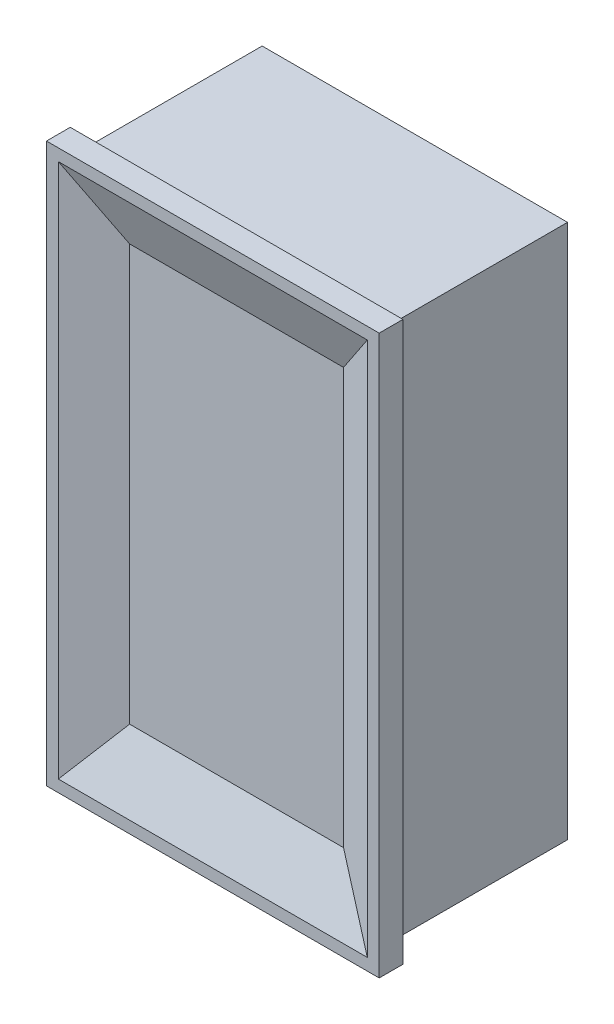
ISO-10303-21;
HEADER;
FILE_DESCRIPTION(('STEP AP214'),'2;1');
FILE_NAME('part.step','',(''),(''),'','','');
FILE_SCHEMA(('AUTOMOTIVE_DESIGN { 1 0 10303 214 1 1 1 1 }'));
ENDSEC;
DATA;
#1=APPLICATION_CONTEXT('core data for automotive mechanical design processes');
#2=APPLICATION_PROTOCOL_DEFINITION('international standard','automotive_design',2000,#1);
#3=PRODUCT_CONTEXT('',#1,'mechanical');
#4=PRODUCT('Part','Part','',(#3));
#5=PRODUCT_RELATED_PRODUCT_CATEGORY('part','',(#4));
#6=PRODUCT_DEFINITION_FORMATION('','',#4);
#7=PRODUCT_DEFINITION_CONTEXT('part definition',#1,'design');
#8=PRODUCT_DEFINITION('design','',#6,#7);
#9=PRODUCT_DEFINITION_SHAPE('','',#8);
#10=(LENGTH_UNIT() NAMED_UNIT(*) SI_UNIT(.MILLI.,.METRE.));
#11=(NAMED_UNIT(*) PLANE_ANGLE_UNIT() SI_UNIT($,.RADIAN.));
#12=(NAMED_UNIT(*) SI_UNIT($,.STERADIAN.) SOLID_ANGLE_UNIT());
#13=UNCERTAINTY_MEASURE_WITH_UNIT(LENGTH_MEASURE(1.E-05),#10,'distance_accuracy_value','');
#14=(GEOMETRIC_REPRESENTATION_CONTEXT(3) GLOBAL_UNCERTAINTY_ASSIGNED_CONTEXT((#13)) GLOBAL_UNIT_ASSIGNED_CONTEXT((#10,
#11,#12)) REPRESENTATION_CONTEXT('',''));
#15=CARTESIAN_POINT('',(0.,0.,0.));
#16=DIRECTION('',(0.,0.,1.));
#17=DIRECTION('',(1.,0.,0.));
#18=AXIS2_PLACEMENT_3D('',#15,#16,#17);
#19=CARTESIAN_POINT('',(0.,0.,15.));
#20=DIRECTION('',(0.,0.,1.));
#21=DIRECTION('',(1.,0.,0.));
#22=AXIS2_PLACEMENT_3D('',#19,#20,#21);
#23=PLANE('',#22);
#24=DIRECTION('',(-1.,0.,0.));
#25=VECTOR('',#24,1.);
#26=CARTESIAN_POINT('',(-14.,23.5,15.));
#27=LINE('',#26,#25);
#28=CARTESIAN_POINT('',(14.,23.5,15.));
#29=VERTEX_POINT('',#28);
#30=CARTESIAN_POINT('',(-14.,23.5,15.));
#31=VERTEX_POINT('',#30);
#32=EDGE_CURVE('E181',#29,#31,#27,.T.);
#33=ORIENTED_EDGE('',*,*,#32,.F.);
#34=DIRECTION('',(0.,1.,0.));
#35=VECTOR('',#34,1.);
#36=CARTESIAN_POINT('',(14.,23.5,15.));
#37=LINE('',#36,#35);
#38=CARTESIAN_POINT('',(14.,-23.5,15.));
#39=VERTEX_POINT('',#38);
#40=EDGE_CURVE('E175',#39,#29,#37,.T.);
#41=ORIENTED_EDGE('',*,*,#40,.F.);
#42=DIRECTION('',(1.,0.,0.));
#43=VECTOR('',#42,1.);
#44=CARTESIAN_POINT('',(13.,-23.5,15.));
#45=LINE('',#44,#43);
#46=CARTESIAN_POINT('',(-14.,-23.5,15.));
#47=VERTEX_POINT('',#46);
#48=EDGE_CURVE('E195',#47,#39,#45,.T.);
#49=ORIENTED_EDGE('',*,*,#48,.F.);
#50=DIRECTION('',(0.,-1.,0.));
#51=VECTOR('',#50,1.);
#52=CARTESIAN_POINT('',(-14.,-22.5,15.));
#53=LINE('',#52,#51);
#54=EDGE_CURVE('E199',#31,#47,#53,.T.);
#55=ORIENTED_EDGE('',*,*,#54,.F.);
#56=EDGE_LOOP('',(#33,#41,#49,#55));
#57=FACE_BOUND('',#56,.T.);
#58=DIRECTION('',(1.,0.,0.));
#59=VECTOR('',#58,1.);
#60=CARTESIAN_POINT('',(12.85,22.5,15.));
#61=LINE('',#60,#59);
#62=CARTESIAN_POINT('',(-12.85,22.5,15.));
#63=VERTEX_POINT('',#62);
#64=CARTESIAN_POINT('',(12.85,22.5,15.));
#65=VERTEX_POINT('',#64);
#66=EDGE_CURVE('E70',#63,#65,#61,.T.);
#67=ORIENTED_EDGE('',*,*,#66,.F.);
#68=DIRECTION('',(0.,1.,0.));
#69=VECTOR('',#68,1.);
#70=CARTESIAN_POINT('',(-12.85,22.5,15.));
#71=LINE('',#70,#69);
#72=CARTESIAN_POINT('',(-12.85,-22.5,15.));
#73=VERTEX_POINT('',#72);
#74=EDGE_CURVE('E74',#73,#63,#71,.T.);
#75=ORIENTED_EDGE('',*,*,#74,.F.);
#76=DIRECTION('',(-1.,0.,0.));
#77=VECTOR('',#76,1.);
#78=CARTESIAN_POINT('',(-12.85,-22.5,15.));
#79=LINE('',#78,#77);
#80=CARTESIAN_POINT('',(12.85,-22.5,15.));
#81=VERTEX_POINT('',#80);
#82=EDGE_CURVE('E675',#81,#73,#79,.T.);
#83=ORIENTED_EDGE('',*,*,#82,.F.);
#84=DIRECTION('',(0.,-1.,0.));
#85=VECTOR('',#84,1.);
#86=CARTESIAN_POINT('',(12.85,-22.5,15.));
#87=LINE('',#86,#85);
#88=EDGE_CURVE('E681',#65,#81,#87,.T.);
#89=ORIENTED_EDGE('',*,*,#88,.F.);
#90=EDGE_LOOP('',(#67,#75,#83,#89));
#91=FACE_BOUND('',#90,.T.);
#92=ADVANCED_FACE('F53',(#57,#91),#23,.F.);
#93=CARTESIAN_POINT('',(0.,-20.,16.));
#94=DIRECTION('',(0.,-0.371390676354086,-0.928476690885266));
#95=DIRECTION('',(0.,-0.928476690885266,0.371390676354086));
#96=AXIS2_PLACEMENT_3D('',#93,#94,#95);
#97=PLANE('',#96);
#98=DIRECTION('',(0.596284793999924,-0.74535599249993,0.298142397000012));
#99=VECTOR('',#98,1.);
#100=CARTESIAN_POINT('',(9.,-17.5,15.));
#101=LINE('',#100,#99);
#102=CARTESIAN_POINT('',(9.,-17.5,15.));
#103=VERTEX_POINT('',#102);
#104=CARTESIAN_POINT('',(13.,-22.5,17.));
#105=VERTEX_POINT('',#104);
#106=EDGE_CURVE('E273',#103,#105,#101,.T.);
#107=ORIENTED_EDGE('',*,*,#106,.F.);
#108=DIRECTION('',(-1.,0.,0.));
#109=VECTOR('',#108,1.);
#110=CARTESIAN_POINT('',(9.,-17.5,15.));
#111=LINE('',#110,#109);
#112=CARTESIAN_POINT('',(-9.,-17.5,15.));
#113=VERTEX_POINT('',#112);
#114=EDGE_CURVE('E338',#103,#113,#111,.T.);
#115=ORIENTED_EDGE('',*,*,#114,.T.);
#116=DIRECTION('',(-0.596284793999924,-0.74535599249993,0.298142397000012));
#117=VECTOR('',#116,1.);
#118=CARTESIAN_POINT('',(-9.,-17.5,15.));
#119=LINE('',#118,#117);
#120=CARTESIAN_POINT('',(-12.9999999999998,-22.5,17.));
#121=VERTEX_POINT('',#120);
#122=EDGE_CURVE('E333',#113,#121,#119,.T.);
#123=ORIENTED_EDGE('',*,*,#122,.T.);
#124=DIRECTION('',(1.,0.,0.));
#125=VECTOR('',#124,1.);
#126=CARTESIAN_POINT('',(-13.,-22.5,17.));
#127=LINE('',#126,#125);
#128=EDGE_CURVE('E12',#121,#105,#127,.T.);
#129=ORIENTED_EDGE('',*,*,#128,.T.);
#130=EDGE_LOOP('',(#107,#115,#123,#129));
#131=FACE_BOUND('',#130,.T.);
#132=ADVANCED_FACE('F418',(#131),#97,.F.);
#133=CARTESIAN_POINT('',(-11.,0.,16.));
#134=DIRECTION('',(-0.447213595499998,0.,-0.894427190999896));
#135=DIRECTION('',(-0.894427190999896,0.,0.447213595499998));
#136=AXIS2_PLACEMENT_3D('',#133,#134,#135);
#137=PLANE('',#136);
#138=ORIENTED_EDGE('',*,*,#122,.F.);
#139=DIRECTION('',(0.,1.,0.));
#140=VECTOR('',#139,1.);
#141=CARTESIAN_POINT('',(-9.,-17.5,15.));
#142=LINE('',#141,#140);
#143=CARTESIAN_POINT('',(-9.,17.5,15.));
#144=VERTEX_POINT('',#143);
#145=EDGE_CURVE('E342',#113,#144,#142,.T.);
#146=ORIENTED_EDGE('',*,*,#145,.T.);
#147=DIRECTION('',(-0.596284793999924,0.74535599249993,0.298142397000012));
#148=VECTOR('',#147,1.);
#149=CARTESIAN_POINT('',(-9.,17.5,15.));
#150=LINE('',#149,#148);
#151=CARTESIAN_POINT('',(-12.9999999999998,22.5,17.));
#152=VERTEX_POINT('',#151);
#153=EDGE_CURVE('E296',#144,#152,#150,.T.);
#154=ORIENTED_EDGE('',*,*,#153,.T.);
#155=DIRECTION('',(0.,-1.,0.));
#156=VECTOR('',#155,1.);
#157=CARTESIAN_POINT('',(-13.,22.5,17.));
#158=LINE('',#157,#156);
#159=EDGE_CURVE('E62',#152,#121,#158,.T.);
#160=ORIENTED_EDGE('',*,*,#159,.T.);
#161=EDGE_LOOP('',(#138,#146,#154,#160));
#162=FACE_BOUND('',#161,.T.);
#163=ADVANCED_FACE('F414',(#162),#137,.F.);
#164=CARTESIAN_POINT('',(0.,20.,16.));
#165=DIRECTION('',(0.,0.371390676354086,-0.928476690885266));
#166=DIRECTION('',(-1.,0.,0.));
#167=AXIS2_PLACEMENT_3D('',#164,#165,#166);
#168=PLANE('',#167);
#169=ORIENTED_EDGE('',*,*,#153,.F.);
#170=DIRECTION('',(1.,0.,0.));
#171=VECTOR('',#170,1.);
#172=CARTESIAN_POINT('',(-9.,17.5,15.));
#173=LINE('',#172,#171);
#174=CARTESIAN_POINT('',(9.0000000000002,17.5000000000002,15.));
#175=VERTEX_POINT('',#174);
#176=EDGE_CURVE('E207',#144,#175,#173,.T.);
#177=ORIENTED_EDGE('',*,*,#176,.T.);
#178=DIRECTION('',(0.596284793999924,0.74535599249993,0.298142397000012));
#179=VECTOR('',#178,1.);
#180=CARTESIAN_POINT('',(9.,17.5,15.));
#181=LINE('',#180,#179);
#182=CARTESIAN_POINT('',(13.,22.5,17.));
#183=VERTEX_POINT('',#182);
#184=EDGE_CURVE('E309',#175,#183,#181,.T.);
#185=ORIENTED_EDGE('',*,*,#184,.T.);
#186=DIRECTION('',(-1.,0.,0.));
#187=VECTOR('',#186,1.);
#188=CARTESIAN_POINT('',(13.,22.5,17.));
#189=LINE('',#188,#187);
#190=EDGE_CURVE('E322',#183,#152,#189,.T.);
#191=ORIENTED_EDGE('',*,*,#190,.T.);
#192=EDGE_LOOP('',(#169,#177,#185,#191));
#193=FACE_BOUND('',#192,.T.);
#194=ADVANCED_FACE('F387',(#193),#168,.F.);
#195=CARTESIAN_POINT('',(11.,0.,16.));
#196=DIRECTION('',(0.447213595499998,0.,-0.894427190999896));
#197=DIRECTION('',(0.,-1.,0.));
#198=AXIS2_PLACEMENT_3D('',#195,#196,#197);
#199=PLANE('',#198);
#200=ORIENTED_EDGE('',*,*,#184,.F.);
#201=DIRECTION('',(0.,-1.,0.));
#202=VECTOR('',#201,1.);
#203=CARTESIAN_POINT('',(9.,17.5,15.));
#204=LINE('',#203,#202);
#205=EDGE_CURVE('E202',#175,#103,#204,.T.);
#206=ORIENTED_EDGE('',*,*,#205,.T.);
#207=ORIENTED_EDGE('',*,*,#106,.T.);
#208=DIRECTION('',(0.,1.,0.));
#209=VECTOR('',#208,1.);
#210=CARTESIAN_POINT('',(13.,-22.5,17.));
#211=LINE('',#210,#209);
#212=EDGE_CURVE('E201',#105,#183,#211,.T.);
#213=ORIENTED_EDGE('',*,*,#212,.T.);
#214=EDGE_LOOP('',(#200,#206,#207,#213));
#215=FACE_BOUND('',#214,.T.);
#216=ADVANCED_FACE('F395',(#215),#199,.F.);
#217=CARTESIAN_POINT('',(-14.,22.5,17.));
#218=DIRECTION('',(0.,0.,-1.));
#219=DIRECTION('',(-1.,0.,0.));
#220=AXIS2_PLACEMENT_3D('',#217,#218,#219);
#221=PLANE('',#220);
#222=ORIENTED_EDGE('',*,*,#212,.F.);
#223=ORIENTED_EDGE('',*,*,#128,.F.);
#224=ORIENTED_EDGE('',*,*,#159,.F.);
#225=ORIENTED_EDGE('',*,*,#190,.F.);
#226=EDGE_LOOP('',(#222,#223,#224,#225));
#227=FACE_BOUND('',#226,.T.);
#228=DIRECTION('',(-1.,0.,0.));
#229=VECTOR('',#228,1.);
#230=CARTESIAN_POINT('',(-14.,-23.5,17.));
#231=LINE('',#230,#229);
#232=CARTESIAN_POINT('',(14.,-23.5,17.));
#233=VERTEX_POINT('',#232);
#234=CARTESIAN_POINT('',(-14.,-23.5,17.));
#235=VERTEX_POINT('',#234);
#236=EDGE_CURVE('E189',#233,#235,#231,.T.);
#237=ORIENTED_EDGE('',*,*,#236,.F.);
#238=DIRECTION('',(0.,-1.,0.));
#239=VECTOR('',#238,1.);
#240=CARTESIAN_POINT('',(14.,-23.5,17.));
#241=LINE('',#240,#239);
#242=CARTESIAN_POINT('',(14.,23.5,17.));
#243=VERTEX_POINT('',#242);
#244=EDGE_CURVE('E164',#243,#233,#241,.T.);
#245=ORIENTED_EDGE('',*,*,#244,.F.);
#246=DIRECTION('',(1.,0.,0.));
#247=VECTOR('',#246,1.);
#248=CARTESIAN_POINT('',(13.,23.5,17.));
#249=LINE('',#248,#247);
#250=CARTESIAN_POINT('',(-14.,23.5,17.));
#251=VERTEX_POINT('',#250);
#252=EDGE_CURVE('E187',#251,#243,#249,.T.);
#253=ORIENTED_EDGE('',*,*,#252,.F.);
#254=DIRECTION('',(0.,1.,0.));
#255=VECTOR('',#254,1.);
#256=CARTESIAN_POINT('',(-14.,22.5,17.));
#257=LINE('',#256,#255);
#258=EDGE_CURVE('E197',#235,#251,#257,.T.);
#259=ORIENTED_EDGE('',*,*,#258,.F.);
#260=EDGE_LOOP('',(#237,#245,#253,#259));
#261=FACE_BOUND('',#260,.T.);
#262=ADVANCED_FACE('F416',(#227,#261),#221,.F.);
#263=CARTESIAN_POINT('',(-14.,0.,0.));
#264=DIRECTION('',(1.,0.,0.));
#265=DIRECTION('',(0.,0.,-1.));
#266=AXIS2_PLACEMENT_3D('',#263,#264,#265);
#267=PLANE('',#266);
#268=ORIENTED_EDGE('',*,*,#54,.T.);
#269=DIRECTION('',(0.,0.,-1.));
#270=VECTOR('',#269,1.);
#271=CARTESIAN_POINT('',(-14.,-23.5,15.));
#272=LINE('',#271,#270);
#273=EDGE_CURVE('E192',#235,#47,#272,.T.);
#274=ORIENTED_EDGE('',*,*,#273,.F.);
#275=ORIENTED_EDGE('',*,*,#258,.T.);
#276=DIRECTION('',(0.,0.,1.));
#277=VECTOR('',#276,1.);
#278=CARTESIAN_POINT('',(-14.,23.5,17.));
#279=LINE('',#278,#277);
#280=EDGE_CURVE('E184',#31,#251,#279,.T.);
#281=ORIENTED_EDGE('',*,*,#280,.F.);
#282=EDGE_LOOP('',(#268,#274,#275,#281));
#283=FACE_BOUND('',#282,.T.);
#284=ADVANCED_FACE('F433',(#283),#267,.F.);
#285=CARTESIAN_POINT('',(0.,-23.5,0.));
#286=DIRECTION('',(0.,1.,0.));
#287=DIRECTION('',(0.,0.,1.));
#288=AXIS2_PLACEMENT_3D('',#285,#286,#287);
#289=PLANE('',#288);
#290=ORIENTED_EDGE('',*,*,#48,.T.);
#291=DIRECTION('',(0.,0.,-1.));
#292=VECTOR('',#291,1.);
#293=CARTESIAN_POINT('',(14.,-23.5,15.));
#294=LINE('',#293,#292);
#295=EDGE_CURVE('E167',#233,#39,#294,.T.);
#296=ORIENTED_EDGE('',*,*,#295,.F.);
#297=ORIENTED_EDGE('',*,*,#236,.T.);
#298=ORIENTED_EDGE('',*,*,#273,.T.);
#299=EDGE_LOOP('',(#290,#296,#297,#298));
#300=FACE_BOUND('',#299,.T.);
#301=ADVANCED_FACE('F436',(#300),#289,.F.);
#302=CARTESIAN_POINT('',(0.,23.5,0.));
#303=DIRECTION('',(0.,-1.,0.));
#304=DIRECTION('',(0.,0.,-1.));
#305=AXIS2_PLACEMENT_3D('',#302,#303,#304);
#306=PLANE('',#305);
#307=ORIENTED_EDGE('',*,*,#252,.T.);
#308=DIRECTION('',(0.,0.,1.));
#309=VECTOR('',#308,1.);
#310=CARTESIAN_POINT('',(14.,23.5,17.));
#311=LINE('',#310,#309);
#312=EDGE_CURVE('E178',#29,#243,#311,.T.);
#313=ORIENTED_EDGE('',*,*,#312,.F.);
#314=ORIENTED_EDGE('',*,*,#32,.T.);
#315=ORIENTED_EDGE('',*,*,#280,.T.);
#316=EDGE_LOOP('',(#307,#313,#314,#315));
#317=FACE_BOUND('',#316,.T.);
#318=ADVANCED_FACE('F440',(#317),#306,.F.);
#319=CARTESIAN_POINT('',(14.,0.,0.));
#320=DIRECTION('',(-1.,0.,0.));
#321=DIRECTION('',(0.,0.,1.));
#322=AXIS2_PLACEMENT_3D('',#319,#320,#321);
#323=PLANE('',#322);
#324=ORIENTED_EDGE('',*,*,#244,.T.);
#325=ORIENTED_EDGE('',*,*,#295,.T.);
#326=ORIENTED_EDGE('',*,*,#40,.T.);
#327=ORIENTED_EDGE('',*,*,#312,.T.);
#328=EDGE_LOOP('',(#324,#325,#326,#327));
#329=FACE_BOUND('',#328,.T.);
#330=ADVANCED_FACE('F444',(#329),#323,.F.);
#331=CARTESIAN_POINT('',(0.,0.,0.));
#332=DIRECTION('',(0.,0.,1.));
#333=DIRECTION('',(1.,0.,0.));
#334=AXIS2_PLACEMENT_3D('',#331,#332,#333);
#335=PLANE('',#334);
#336=DIRECTION('',(1.,0.,0.));
#337=VECTOR('',#336,1.);
#338=CARTESIAN_POINT('',(12.85,22.5,0.));
#339=LINE('',#338,#337);
#340=CARTESIAN_POINT('',(-12.85,22.5,0.));
#341=VERTEX_POINT('',#340);
#342=CARTESIAN_POINT('',(12.85,22.5,0.));
#343=VERTEX_POINT('',#342);
#344=EDGE_CURVE('E153',#341,#343,#339,.T.);
#345=ORIENTED_EDGE('',*,*,#344,.T.);
#346=DIRECTION('',(0.,-1.,0.));
#347=VECTOR('',#346,1.);
#348=CARTESIAN_POINT('',(12.85,-22.5,0.));
#349=LINE('',#348,#347);
#350=CARTESIAN_POINT('',(12.85,-22.5,0.));
#351=VERTEX_POINT('',#350);
#352=EDGE_CURVE('E142',#343,#351,#349,.T.);
#353=ORIENTED_EDGE('',*,*,#352,.T.);
#354=DIRECTION('',(-1.,0.,0.));
#355=VECTOR('',#354,1.);
#356=CARTESIAN_POINT('',(-12.85,-22.5,0.));
#357=LINE('',#356,#355);
#358=CARTESIAN_POINT('',(-12.85,-22.5,0.));
#359=VERTEX_POINT('',#358);
#360=EDGE_CURVE('E152',#351,#359,#357,.T.);
#361=ORIENTED_EDGE('',*,*,#360,.T.);
#362=DIRECTION('',(0.,1.,0.));
#363=VECTOR('',#362,1.);
#364=CARTESIAN_POINT('',(-12.85,22.5,0.));
#365=LINE('',#364,#363);
#366=EDGE_CURVE('E158',#359,#341,#365,.T.);
#367=ORIENTED_EDGE('',*,*,#366,.T.);
#368=EDGE_LOOP('',(#345,#353,#361,#367));
#369=FACE_BOUND('',#368,.T.);
#370=ADVANCED_FACE('F156',(#369),#335,.F.);
#371=CARTESIAN_POINT('',(-12.85,22.5,0.));
#372=DIRECTION('',(1.,0.,0.));
#373=DIRECTION('',(0.,0.,-1.));
#374=AXIS2_PLACEMENT_3D('',#371,#372,#373);
#375=PLANE('',#374);
#376=ORIENTED_EDGE('',*,*,#74,.T.);
#377=DIRECTION('',(0.,0.,1.));
#378=VECTOR('',#377,1.);
#379=CARTESIAN_POINT('',(-12.85,22.5,0.));
#380=LINE('',#379,#378);
#381=EDGE_CURVE('E673',#341,#63,#380,.T.);
#382=ORIENTED_EDGE('',*,*,#381,.F.);
#383=ORIENTED_EDGE('',*,*,#366,.F.);
#384=DIRECTION('',(0.,0.,1.));
#385=VECTOR('',#384,1.);
#386=CARTESIAN_POINT('',(-12.85,-22.5,0.));
#387=LINE('',#386,#385);
#388=EDGE_CURVE('E169',#359,#73,#387,.T.);
#389=ORIENTED_EDGE('',*,*,#388,.T.);
#390=EDGE_LOOP('',(#376,#382,#383,#389));
#391=FACE_BOUND('',#390,.T.);
#392=ADVANCED_FACE('F456',(#391),#375,.F.);
#393=CARTESIAN_POINT('',(-12.85,-22.5,0.));
#394=DIRECTION('',(0.,1.,0.));
#395=DIRECTION('',(0.,0.,1.));
#396=AXIS2_PLACEMENT_3D('',#393,#394,#395);
#397=PLANE('',#396);
#398=ORIENTED_EDGE('',*,*,#82,.T.);
#399=ORIENTED_EDGE('',*,*,#388,.F.);
#400=ORIENTED_EDGE('',*,*,#360,.F.);
#401=DIRECTION('',(0.,0.,1.));
#402=VECTOR('',#401,1.);
#403=CARTESIAN_POINT('',(12.85,-22.5,0.));
#404=LINE('',#403,#402);
#405=EDGE_CURVE('E149',#351,#81,#404,.T.);
#406=ORIENTED_EDGE('',*,*,#405,.T.);
#407=EDGE_LOOP('',(#398,#399,#400,#406));
#408=FACE_BOUND('',#407,.T.);
#409=ADVANCED_FACE('F453',(#408),#397,.F.);
#410=CARTESIAN_POINT('',(12.85,-22.5,0.));
#411=DIRECTION('',(-1.,0.,0.));
#412=DIRECTION('',(0.,0.,1.));
#413=AXIS2_PLACEMENT_3D('',#410,#411,#412);
#414=PLANE('',#413);
#415=ORIENTED_EDGE('',*,*,#88,.T.);
#416=ORIENTED_EDGE('',*,*,#405,.F.);
#417=ORIENTED_EDGE('',*,*,#352,.F.);
#418=DIRECTION('',(0.,0.,1.));
#419=VECTOR('',#418,1.);
#420=CARTESIAN_POINT('',(12.85,22.5,0.));
#421=LINE('',#420,#419);
#422=EDGE_CURVE('E147',#343,#65,#421,.T.);
#423=ORIENTED_EDGE('',*,*,#422,.T.);
#424=EDGE_LOOP('',(#415,#416,#417,#423));
#425=FACE_BOUND('',#424,.T.);
#426=ADVANCED_FACE('F145',(#425),#414,.F.);
#427=CARTESIAN_POINT('',(12.85,22.5,0.));
#428=DIRECTION('',(0.,-1.,0.));
#429=DIRECTION('',(0.,0.,-1.));
#430=AXIS2_PLACEMENT_3D('',#427,#428,#429);
#431=PLANE('',#430);
#432=ORIENTED_EDGE('',*,*,#66,.T.);
#433=ORIENTED_EDGE('',*,*,#422,.F.);
#434=ORIENTED_EDGE('',*,*,#344,.F.);
#435=ORIENTED_EDGE('',*,*,#381,.T.);
#436=EDGE_LOOP('',(#432,#433,#434,#435));
#437=FACE_BOUND('',#436,.T.);
#438=ADVANCED_FACE('F163',(#437),#431,.F.);
#439=CARTESIAN_POINT('',(0.,0.,15.));
#440=DIRECTION('',(0.,0.,1.));
#441=DIRECTION('',(1.,0.,0.));
#442=AXIS2_PLACEMENT_3D('',#439,#440,#441);
#443=PLANE('',#442);
#444=ORIENTED_EDGE('',*,*,#145,.F.);
#445=ORIENTED_EDGE('',*,*,#114,.F.);
#446=ORIENTED_EDGE('',*,*,#205,.F.);
#447=ORIENTED_EDGE('',*,*,#176,.F.);
#448=EDGE_LOOP('',(#444,#445,#446,#447));
#449=FACE_BOUND('',#448,.T.);
#450=ADVANCED_FACE('F392',(#449),#443,.T.);
#451=CLOSED_SHELL('',(#92,#132,#163,#194,#216,#262,#284,#301,#318,#330,#370,#392,#409,#426,#438,#450));
#452=MANIFOLD_SOLID_BREP('B2',#451);
#453=ADVANCED_BREP_SHAPE_REPRESENTATION('',(#18,#452),#14);
#454=SHAPE_DEFINITION_REPRESENTATION(#9,#453);
ENDSEC;
END-ISO-10303-21;
